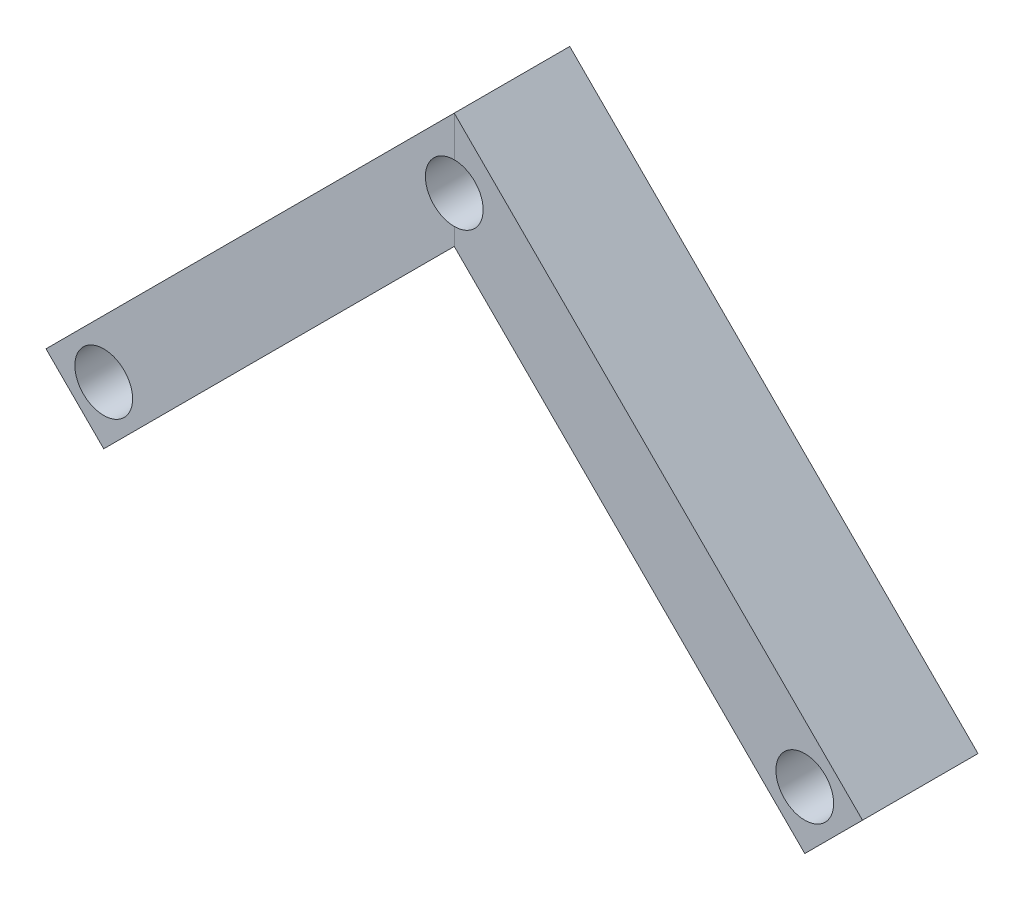
ISO-10303-21;
HEADER;
FILE_DESCRIPTION(('STEP AP214'),'2;1');
FILE_NAME('part.step','',(''),(''),'','','');
FILE_SCHEMA(('AUTOMOTIVE_DESIGN { 1 0 10303 214 1 1 1 1 }'));
ENDSEC;
DATA;
#1=APPLICATION_CONTEXT('core data for automotive mechanical design processes');
#2=APPLICATION_PROTOCOL_DEFINITION('international standard','automotive_design',2000,#1);
#3=PRODUCT_CONTEXT('',#1,'mechanical');
#4=PRODUCT('Part','Part','',(#3));
#5=PRODUCT_RELATED_PRODUCT_CATEGORY('part','',(#4));
#6=PRODUCT_DEFINITION_FORMATION('','',#4);
#7=PRODUCT_DEFINITION_CONTEXT('part definition',#1,'design');
#8=PRODUCT_DEFINITION('design','',#6,#7);
#9=PRODUCT_DEFINITION_SHAPE('','',#8);
#10=(LENGTH_UNIT() NAMED_UNIT(*) SI_UNIT(.MILLI.,.METRE.));
#11=(NAMED_UNIT(*) PLANE_ANGLE_UNIT() SI_UNIT($,.RADIAN.));
#12=(NAMED_UNIT(*) SI_UNIT($,.STERADIAN.) SOLID_ANGLE_UNIT());
#13=UNCERTAINTY_MEASURE_WITH_UNIT(LENGTH_MEASURE(1.E-05),#10,'distance_accuracy_value','');
#14=(GEOMETRIC_REPRESENTATION_CONTEXT(3) GLOBAL_UNCERTAINTY_ASSIGNED_CONTEXT((#13)) GLOBAL_UNIT_ASSIGNED_CONTEXT((#10,
#11,#12)) REPRESENTATION_CONTEXT('',''));
#15=CARTESIAN_POINT('',(0.,0.,0.));
#16=DIRECTION('',(0.,0.,1.));
#17=DIRECTION('',(1.,0.,0.));
#18=AXIS2_PLACEMENT_3D('',#15,#16,#17);
#19=CARTESIAN_POINT('',(70.7106781186548,60.7106781186548,-10.));
#20=DIRECTION('',(0.,0.,-1.));
#21=DIRECTION('',(-1.,0.,0.));
#22=AXIS2_PLACEMENT_3D('',#19,#20,#21);
#23=PLANE('',#22);
#24=CARTESIAN_POINT('',(70.7106781186547,68.7106781186548,-10.));
#25=DIRECTION('',(0.,0.,1.));
#26=DIRECTION('',(1.,0.,0.));
#27=AXIS2_PLACEMENT_3D('',#24,#25,#26);
#28=CIRCLE('',#27,5.00000000000001);
#29=CARTESIAN_POINT('',(70.7106781186547,63.7106781186547,-10.));
#30=VERTEX_POINT('',#29);
#31=CARTESIAN_POINT('',(70.7106781186547,73.7106781186548,-10.));
#32=VERTEX_POINT('',#31);
#33=EDGE_CURVE('E62',#30,#32,#28,.T.);
#34=ORIENTED_EDGE('',*,*,#33,.T.);
#35=DIRECTION('',(0.,1.,0.));
#36=VECTOR('',#35,1.);
#37=CARTESIAN_POINT('',(70.7106781186547,60.7106781186547,-10.));
#38=LINE('',#37,#36);
#39=CARTESIAN_POINT('',(70.7106781186547,80.7106781186547,-10.));
#40=VERTEX_POINT('',#39);
#41=EDGE_CURVE('E122',#32,#40,#38,.T.);
#42=ORIENTED_EDGE('',*,*,#41,.T.);
#43=DIRECTION('',(0.707106781186547,-0.707106781186547,0.));
#44=VECTOR('',#43,1.);
#45=CARTESIAN_POINT('',(70.7106781186548,80.7106781186548,-10.));
#46=LINE('',#45,#44);
#47=CARTESIAN_POINT('',(141.421356237309,10.,-10.));
#48=VERTEX_POINT('',#47);
#49=EDGE_CURVE('E165',#40,#48,#46,.T.);
#50=ORIENTED_EDGE('',*,*,#49,.T.);
#51=DIRECTION('',(-0.707106781186556,-0.707106781186539,0.));
#52=VECTOR('',#51,1.);
#53=CARTESIAN_POINT('',(141.421356237309,10.,-10.));
#54=LINE('',#53,#52);
#55=CARTESIAN_POINT('',(131.421356237309,1.23111156685729E-13,-10.));
#56=VERTEX_POINT('',#55);
#57=EDGE_CURVE('E237',#48,#56,#54,.T.);
#58=ORIENTED_EDGE('',*,*,#57,.T.);
#59=DIRECTION('',(0.707106781186547,-0.707106781186547,0.));
#60=VECTOR('',#59,1.);
#61=CARTESIAN_POINT('',(70.7106781186548,60.7106781186548,-10.));
#62=LINE('',#61,#60);
#63=CARTESIAN_POINT('',(70.7106781186547,60.7106781186547,-10.));
#64=VERTEX_POINT('',#63);
#65=EDGE_CURVE('E169',#64,#56,#62,.T.);
#66=ORIENTED_EDGE('',*,*,#65,.F.);
#67=EDGE_CURVE('E125',#64,#30,#38,.T.);
#68=ORIENTED_EDGE('',*,*,#67,.T.);
#69=EDGE_LOOP('',(#34,#42,#50,#58,#66,#68));
#70=FACE_BOUND('',#69,.T.);
#71=CARTESIAN_POINT('',(131.421356237309,10.0000000000001,-10.));
#72=DIRECTION('',(0.,0.,1.));
#73=DIRECTION('',(-1.,0.,0.));
#74=AXIS2_PLACEMENT_3D('',#71,#72,#73);
#75=CIRCLE('',#74,4.99999999999999);
#76=CARTESIAN_POINT('',(126.421356237309,10.0000000000001,-10.));
#77=VERTEX_POINT('',#76);
#78=EDGE_CURVE('E225',#77,#77,#75,.T.);
#79=ORIENTED_EDGE('',*,*,#78,.T.);
#80=EDGE_LOOP('',(#79));
#81=FACE_BOUND('',#80,.T.);
#82=ADVANCED_FACE('F45',(#70,#81),#23,.T.);
#83=CARTESIAN_POINT('',(70.7106781186548,80.7106781186548,10.));
#84=DIRECTION('',(0.707106781186547,0.707106781186547,0.));
#85=DIRECTION('',(-0.707106781186548,0.707106781186548,0.));
#86=AXIS2_PLACEMENT_3D('',#83,#84,#85);
#87=PLANE('',#86);
#88=DIRECTION('',(0.707106781186547,-0.707106781186547,0.));
#89=VECTOR('',#88,1.);
#90=CARTESIAN_POINT('',(70.7106781186548,80.7106781186548,10.));
#91=LINE('',#90,#89);
#92=CARTESIAN_POINT('',(70.7106781186547,80.7106781186547,10.));
#93=VERTEX_POINT('',#92);
#94=CARTESIAN_POINT('',(141.421356237309,10.,10.));
#95=VERTEX_POINT('',#94);
#96=EDGE_CURVE('E175',#93,#95,#91,.T.);
#97=ORIENTED_EDGE('',*,*,#96,.T.);
#98=DIRECTION('',(0.,0.,1.));
#99=VECTOR('',#98,1.);
#100=CARTESIAN_POINT('',(141.42135623731,10.,10.));
#101=LINE('',#100,#99);
#102=EDGE_CURVE('E168',#48,#95,#101,.T.);
#103=ORIENTED_EDGE('',*,*,#102,.F.);
#104=ORIENTED_EDGE('',*,*,#49,.F.);
#105=DIRECTION('',(0.,0.,1.));
#106=VECTOR('',#105,1.);
#107=CARTESIAN_POINT('',(70.7106781186547,80.7106781186547,10.));
#108=LINE('',#107,#106);
#109=EDGE_CURVE('E146',#40,#93,#108,.T.);
#110=ORIENTED_EDGE('',*,*,#109,.T.);
#111=EDGE_LOOP('',(#97,#103,#104,#110));
#112=FACE_BOUND('',#111,.T.);
#113=ADVANCED_FACE('F206',(#112),#87,.T.);
#114=CARTESIAN_POINT('',(70.7106781186548,60.7106781186548,10.));
#115=DIRECTION('',(0.,0.,1.));
#116=DIRECTION('',(1.,0.,0.));
#117=AXIS2_PLACEMENT_3D('',#114,#115,#116);
#118=PLANE('',#117);
#119=CARTESIAN_POINT('',(70.7106781186547,68.7106781186548,10.));
#120=DIRECTION('',(0.,0.,1.));
#121=DIRECTION('',(1.,0.,0.));
#122=AXIS2_PLACEMENT_3D('',#119,#120,#121);
#123=CIRCLE('',#122,5.00000000000001);
#124=CARTESIAN_POINT('',(70.7106781186547,63.7106781186547,10.));
#125=VERTEX_POINT('',#124);
#126=CARTESIAN_POINT('',(70.7106781186547,73.7106781186548,10.));
#127=VERTEX_POINT('',#126);
#128=EDGE_CURVE('E69',#125,#127,#123,.T.);
#129=ORIENTED_EDGE('',*,*,#128,.F.);
#130=DIRECTION('',(0.,-1.,0.));
#131=VECTOR('',#130,1.);
#132=CARTESIAN_POINT('',(70.7106781186547,60.7106781186547,10.));
#133=LINE('',#132,#131);
#134=CARTESIAN_POINT('',(70.7106781186547,60.7106781186547,10.));
#135=VERTEX_POINT('',#134);
#136=EDGE_CURVE('E157',#125,#135,#133,.T.);
#137=ORIENTED_EDGE('',*,*,#136,.T.);
#138=DIRECTION('',(0.707106781186547,-0.707106781186547,0.));
#139=VECTOR('',#138,1.);
#140=CARTESIAN_POINT('',(70.7106781186548,60.7106781186548,10.));
#141=LINE('',#140,#139);
#142=CARTESIAN_POINT('',(131.421356237309,1.94289029309402E-13,10.));
#143=VERTEX_POINT('',#142);
#144=EDGE_CURVE('E49',#135,#143,#141,.T.);
#145=ORIENTED_EDGE('',*,*,#144,.T.);
#146=DIRECTION('',(-0.707106781186556,-0.707106781186539,0.));
#147=VECTOR('',#146,1.);
#148=CARTESIAN_POINT('',(141.421356237309,10.,10.));
#149=LINE('',#148,#147);
#150=EDGE_CURVE('E143',#95,#143,#149,.T.);
#151=ORIENTED_EDGE('',*,*,#150,.F.);
#152=ORIENTED_EDGE('',*,*,#96,.F.);
#153=EDGE_CURVE('E158',#93,#127,#133,.T.);
#154=ORIENTED_EDGE('',*,*,#153,.T.);
#155=EDGE_LOOP('',(#129,#137,#145,#151,#152,#154));
#156=FACE_BOUND('',#155,.T.);
#157=CARTESIAN_POINT('',(131.421356237309,10.0000000000001,10.));
#158=DIRECTION('',(0.,0.,1.));
#159=DIRECTION('',(-1.,0.,0.));
#160=AXIS2_PLACEMENT_3D('',#157,#158,#159);
#161=CIRCLE('',#160,4.99999999999999);
#162=CARTESIAN_POINT('',(126.421356237309,10.0000000000001,10.));
#163=VERTEX_POINT('',#162);
#164=EDGE_CURVE('E221',#163,#163,#161,.T.);
#165=ORIENTED_EDGE('',*,*,#164,.F.);
#166=EDGE_LOOP('',(#165));
#167=FACE_BOUND('',#166,.T.);
#168=ADVANCED_FACE('F186',(#156,#167),#118,.T.);
#169=CARTESIAN_POINT('',(70.7106781186548,60.7106781186548,10.));
#170=DIRECTION('',(-0.707106781186547,-0.707106781186547,0.));
#171=DIRECTION('',(0.707106781186548,-0.707106781186548,0.));
#172=AXIS2_PLACEMENT_3D('',#169,#170,#171);
#173=PLANE('',#172);
#174=DIRECTION('',(0.,0.,1.));
#175=VECTOR('',#174,1.);
#176=CARTESIAN_POINT('',(131.421356237309,1.23111156685729E-13,-10.));
#177=LINE('',#176,#175);
#178=EDGE_CURVE('E117',#56,#143,#177,.T.);
#179=ORIENTED_EDGE('',*,*,#178,.T.);
#180=ORIENTED_EDGE('',*,*,#144,.F.);
#181=DIRECTION('',(0.,0.,-1.));
#182=VECTOR('',#181,1.);
#183=CARTESIAN_POINT('',(70.7106781186547,60.7106781186547,10.));
#184=LINE('',#183,#182);
#185=EDGE_CURVE('E11',#135,#64,#184,.T.);
#186=ORIENTED_EDGE('',*,*,#185,.T.);
#187=ORIENTED_EDGE('',*,*,#65,.T.);
#188=EDGE_LOOP('',(#179,#180,#186,#187));
#189=FACE_BOUND('',#188,.T.);
#190=ADVANCED_FACE('F47',(#189),#173,.T.);
#191=CARTESIAN_POINT('',(0.,-10.,-10.));
#192=DIRECTION('',(0.,0.,-1.));
#193=DIRECTION('',(-1.,0.,0.));
#194=AXIS2_PLACEMENT_3D('',#191,#192,#193);
#195=PLANE('',#194);
#196=EDGE_CURVE('E110',#32,#30,#28,.T.);
#197=ORIENTED_EDGE('',*,*,#196,.T.);
#198=ORIENTED_EDGE('',*,*,#67,.F.);
#199=DIRECTION('',(0.707106781186547,0.707106781186547,0.));
#200=VECTOR('',#199,1.);
#201=CARTESIAN_POINT('',(0.,-10.,-10.));
#202=LINE('',#201,#200);
#203=CARTESIAN_POINT('',(10.0000000000001,1.196959198424E-13,-10.));
#204=VERTEX_POINT('',#203);
#205=EDGE_CURVE('E135',#204,#64,#202,.T.);
#206=ORIENTED_EDGE('',*,*,#205,.F.);
#207=DIRECTION('',(-0.707106781186556,0.707106781186539,0.));
#208=VECTOR('',#207,1.);
#209=CARTESIAN_POINT('',(0.,10.,-10.));
#210=LINE('',#209,#208);
#211=CARTESIAN_POINT('',(0.,10.,-10.));
#212=VERTEX_POINT('',#211);
#213=EDGE_CURVE('E197',#204,#212,#210,.T.);
#214=ORIENTED_EDGE('',*,*,#213,.T.);
#215=DIRECTION('',(0.707106781186547,0.707106781186547,0.));
#216=VECTOR('',#215,1.);
#217=CARTESIAN_POINT('',(0.,10.,-10.));
#218=LINE('',#217,#216);
#219=EDGE_CURVE('E133',#212,#40,#218,.T.);
#220=ORIENTED_EDGE('',*,*,#219,.T.);
#221=ORIENTED_EDGE('',*,*,#41,.F.);
#222=EDGE_LOOP('',(#197,#198,#206,#214,#220,#221));
#223=FACE_BOUND('',#222,.T.);
#224=CARTESIAN_POINT('',(10.0000000000001,10.0000000000001,-10.));
#225=DIRECTION('',(0.,0.,1.));
#226=DIRECTION('',(1.,0.,0.));
#227=AXIS2_PLACEMENT_3D('',#224,#225,#226);
#228=CIRCLE('',#227,5.);
#229=CARTESIAN_POINT('',(15.0000000000001,10.0000000000001,-10.));
#230=VERTEX_POINT('',#229);
#231=EDGE_CURVE('E217',#230,#230,#228,.T.);
#232=ORIENTED_EDGE('',*,*,#231,.T.);
#233=EDGE_LOOP('',(#232));
#234=FACE_BOUND('',#233,.T.);
#235=ADVANCED_FACE('F129',(#223,#234),#195,.T.);
#236=CARTESIAN_POINT('',(0.,10.,10.));
#237=DIRECTION('',(-0.707106781186547,0.707106781186547,0.));
#238=DIRECTION('',(-0.707106781186548,-0.707106781186548,0.));
#239=AXIS2_PLACEMENT_3D('',#236,#237,#238);
#240=PLANE('',#239);
#241=DIRECTION('',(0.707106781186547,0.707106781186547,0.));
#242=VECTOR('',#241,1.);
#243=CARTESIAN_POINT('',(0.,10.,10.));
#244=LINE('',#243,#242);
#245=CARTESIAN_POINT('',(0.,10.,10.));
#246=VERTEX_POINT('',#245);
#247=EDGE_CURVE('E153',#246,#93,#244,.T.);
#248=ORIENTED_EDGE('',*,*,#247,.T.);
#249=ORIENTED_EDGE('',*,*,#109,.F.);
#250=ORIENTED_EDGE('',*,*,#219,.F.);
#251=DIRECTION('',(0.,0.,1.));
#252=VECTOR('',#251,1.);
#253=CARTESIAN_POINT('',(0.,10.,10.));
#254=LINE('',#253,#252);
#255=EDGE_CURVE('E139',#212,#246,#254,.T.);
#256=ORIENTED_EDGE('',*,*,#255,.T.);
#257=EDGE_LOOP('',(#248,#249,#250,#256));
#258=FACE_BOUND('',#257,.T.);
#259=ADVANCED_FACE('F204',(#258),#240,.T.);
#260=CARTESIAN_POINT('',(0.,-10.,10.));
#261=DIRECTION('',(0.,0.,1.));
#262=DIRECTION('',(1.,0.,0.));
#263=AXIS2_PLACEMENT_3D('',#260,#261,#262);
#264=PLANE('',#263);
#265=EDGE_CURVE('E127',#127,#125,#123,.T.);
#266=ORIENTED_EDGE('',*,*,#265,.F.);
#267=ORIENTED_EDGE('',*,*,#153,.F.);
#268=ORIENTED_EDGE('',*,*,#247,.F.);
#269=DIRECTION('',(-0.707106781186556,0.707106781186539,0.));
#270=VECTOR('',#269,1.);
#271=CARTESIAN_POINT('',(0.,10.,10.));
#272=LINE('',#271,#270);
#273=CARTESIAN_POINT('',(10.0000000000001,1.23111156685729E-13,10.));
#274=VERTEX_POINT('',#273);
#275=EDGE_CURVE('E200',#274,#246,#272,.T.);
#276=ORIENTED_EDGE('',*,*,#275,.F.);
#277=DIRECTION('',(0.707106781186547,0.707106781186547,0.));
#278=VECTOR('',#277,1.);
#279=CARTESIAN_POINT('',(0.,-10.,10.));
#280=LINE('',#279,#278);
#281=EDGE_CURVE('E55',#274,#135,#280,.T.);
#282=ORIENTED_EDGE('',*,*,#281,.T.);
#283=ORIENTED_EDGE('',*,*,#136,.F.);
#284=EDGE_LOOP('',(#266,#267,#268,#276,#282,#283));
#285=FACE_BOUND('',#284,.T.);
#286=CARTESIAN_POINT('',(10.0000000000001,10.0000000000001,10.));
#287=DIRECTION('',(0.,0.,1.));
#288=DIRECTION('',(1.,0.,0.));
#289=AXIS2_PLACEMENT_3D('',#286,#287,#288);
#290=CIRCLE('',#289,5.);
#291=CARTESIAN_POINT('',(15.0000000000001,10.0000000000001,10.));
#292=VERTEX_POINT('',#291);
#293=EDGE_CURVE('E215',#292,#292,#290,.T.);
#294=ORIENTED_EDGE('',*,*,#293,.F.);
#295=EDGE_LOOP('',(#294));
#296=FACE_BOUND('',#295,.T.);
#297=ADVANCED_FACE('F209',(#285,#296),#264,.T.);
#298=CARTESIAN_POINT('',(0.,-10.,10.));
#299=DIRECTION('',(0.707106781186547,-0.707106781186547,0.));
#300=DIRECTION('',(0.707106781186548,0.707106781186548,0.));
#301=AXIS2_PLACEMENT_3D('',#298,#299,#300);
#302=PLANE('',#301);
#303=DIRECTION('',(0.,0.,1.));
#304=VECTOR('',#303,1.);
#305=CARTESIAN_POINT('',(10.0000000000001,1.23111156685729E-13,-10.));
#306=LINE('',#305,#304);
#307=EDGE_CURVE('E173',#204,#274,#306,.T.);
#308=ORIENTED_EDGE('',*,*,#307,.F.);
#309=ORIENTED_EDGE('',*,*,#205,.T.);
#310=ORIENTED_EDGE('',*,*,#185,.F.);
#311=ORIENTED_EDGE('',*,*,#281,.F.);
#312=EDGE_LOOP('',(#308,#309,#310,#311));
#313=FACE_BOUND('',#312,.T.);
#314=ADVANCED_FACE('F195',(#313),#302,.T.);
#315=CARTESIAN_POINT('',(0.,10.,-10.));
#316=DIRECTION('',(0.707106781186539,0.707106781186556,0.));
#317=DIRECTION('',(-0.707106781186556,0.707106781186539,0.));
#318=AXIS2_PLACEMENT_3D('',#315,#316,#317);
#319=PLANE('',#318);
#320=ORIENTED_EDGE('',*,*,#255,.F.);
#321=ORIENTED_EDGE('',*,*,#213,.F.);
#322=ORIENTED_EDGE('',*,*,#307,.T.);
#323=ORIENTED_EDGE('',*,*,#275,.T.);
#324=EDGE_LOOP('',(#320,#321,#322,#323));
#325=FACE_BOUND('',#324,.T.);
#326=ADVANCED_FACE('F245',(#325),#319,.F.);
#327=CARTESIAN_POINT('',(141.421356237309,10.,-10.));
#328=DIRECTION('',(-0.707106781186539,0.707106781186556,0.));
#329=DIRECTION('',(-0.707106781186556,-0.707106781186539,0.));
#330=AXIS2_PLACEMENT_3D('',#327,#328,#329);
#331=PLANE('',#330);
#332=ORIENTED_EDGE('',*,*,#178,.F.);
#333=ORIENTED_EDGE('',*,*,#57,.F.);
#334=ORIENTED_EDGE('',*,*,#102,.T.);
#335=ORIENTED_EDGE('',*,*,#150,.T.);
#336=EDGE_LOOP('',(#332,#333,#334,#335));
#337=FACE_BOUND('',#336,.T.);
#338=ADVANCED_FACE('F242',(#337),#331,.F.);
#339=CARTESIAN_POINT('',(10.0000000000001,10.0000000000001,-10.));
#340=DIRECTION('',(0.,0.,1.));
#341=DIRECTION('',(1.,0.,0.));
#342=AXIS2_PLACEMENT_3D('',#339,#340,#341);
#343=CYLINDRICAL_SURFACE('',#342,5.);
#344=ORIENTED_EDGE('',*,*,#231,.F.);
#345=EDGE_LOOP('',(#344));
#346=FACE_BOUND('',#345,.T.);
#347=ORIENTED_EDGE('',*,*,#293,.T.);
#348=EDGE_LOOP('',(#347));
#349=FACE_BOUND('',#348,.T.);
#350=ADVANCED_FACE('F244',(#346,#349),#343,.F.);
#351=CARTESIAN_POINT('',(70.7106781186547,68.7106781186548,-10.));
#352=DIRECTION('',(0.,0.,1.));
#353=DIRECTION('',(1.,0.,0.));
#354=AXIS2_PLACEMENT_3D('',#351,#352,#353);
#355=CYLINDRICAL_SURFACE('',#354,5.00000000000001);
#356=ORIENTED_EDGE('',*,*,#196,.F.);
#357=ORIENTED_EDGE('',*,*,#33,.F.);
#358=EDGE_LOOP('',(#356,#357));
#359=FACE_BOUND('',#358,.T.);
#360=ORIENTED_EDGE('',*,*,#265,.T.);
#361=ORIENTED_EDGE('',*,*,#128,.T.);
#362=EDGE_LOOP('',(#360,#361));
#363=FACE_BOUND('',#362,.T.);
#364=ADVANCED_FACE('F111',(#359,#363),#355,.F.);
#365=CARTESIAN_POINT('',(131.421356237309,10.0000000000001,-10.));
#366=DIRECTION('',(0.,0.,1.));
#367=DIRECTION('',(1.,0.,0.));
#368=AXIS2_PLACEMENT_3D('',#365,#366,#367);
#369=CYLINDRICAL_SURFACE('',#368,4.99999999999999);
#370=ORIENTED_EDGE('',*,*,#78,.F.);
#371=EDGE_LOOP('',(#370));
#372=FACE_BOUND('',#371,.T.);
#373=ORIENTED_EDGE('',*,*,#164,.T.);
#374=EDGE_LOOP('',(#373));
#375=FACE_BOUND('',#374,.T.);
#376=ADVANCED_FACE('F317',(#372,#375),#369,.F.);
#377=CLOSED_SHELL('',(#82,#113,#168,#190,#235,#259,#297,#314,#326,#338,#350,#364,#376));
#378=MANIFOLD_SOLID_BREP('B2',#377);
#379=ADVANCED_BREP_SHAPE_REPRESENTATION('',(#18,#378),#14);
#380=SHAPE_DEFINITION_REPRESENTATION(#9,#379);
ENDSEC;
END-ISO-10303-21;
